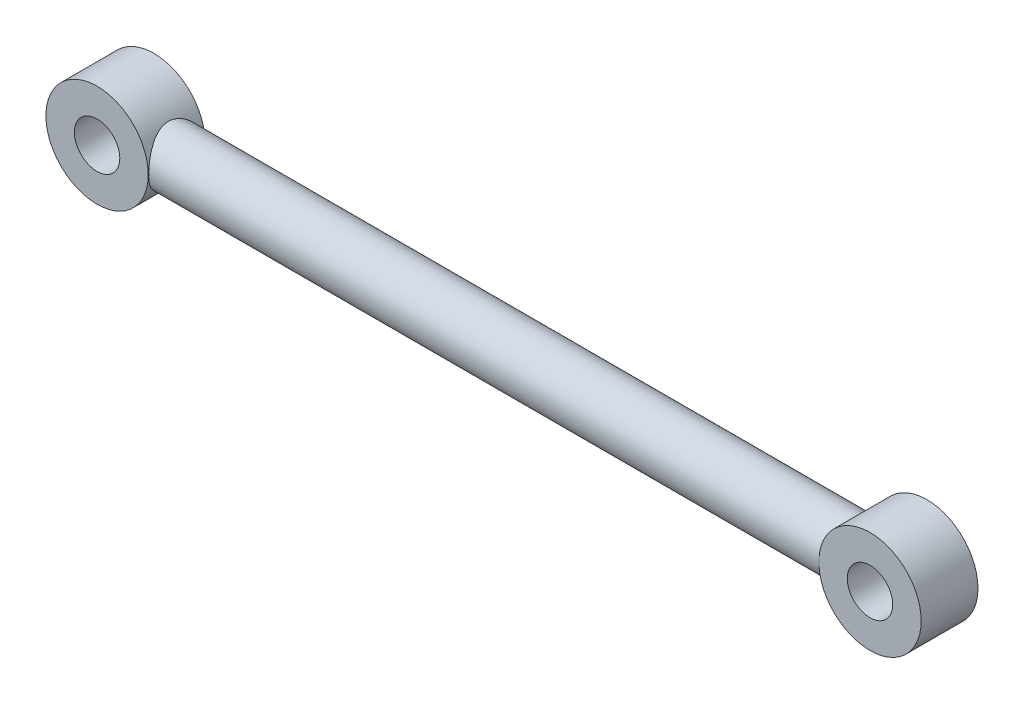
ISO-10303-21;
HEADER;
FILE_DESCRIPTION(('STEP AP214'),'2;1');
FILE_NAME('part.step','',(''),(''),'','','');
FILE_SCHEMA(('AUTOMOTIVE_DESIGN { 1 0 10303 214 1 1 1 1 }'));
ENDSEC;
DATA;
#1=APPLICATION_CONTEXT('core data for automotive mechanical design processes');
#2=APPLICATION_PROTOCOL_DEFINITION('international standard','automotive_design',2000,#1);
#3=PRODUCT_CONTEXT('',#1,'mechanical');
#4=PRODUCT('Part','Part','',(#3));
#5=PRODUCT_RELATED_PRODUCT_CATEGORY('part','',(#4));
#6=PRODUCT_DEFINITION_FORMATION('','',#4);
#7=PRODUCT_DEFINITION_CONTEXT('part definition',#1,'design');
#8=PRODUCT_DEFINITION('design','',#6,#7);
#9=PRODUCT_DEFINITION_SHAPE('','',#8);
#10=(LENGTH_UNIT() NAMED_UNIT(*) SI_UNIT(.MILLI.,.METRE.));
#11=(NAMED_UNIT(*) PLANE_ANGLE_UNIT() SI_UNIT($,.RADIAN.));
#12=(NAMED_UNIT(*) SI_UNIT($,.STERADIAN.) SOLID_ANGLE_UNIT());
#13=UNCERTAINTY_MEASURE_WITH_UNIT(LENGTH_MEASURE(1.E-05),#10,'distance_accuracy_value','');
#14=(GEOMETRIC_REPRESENTATION_CONTEXT(3) GLOBAL_UNCERTAINTY_ASSIGNED_CONTEXT((#13)) GLOBAL_UNIT_ASSIGNED_CONTEXT((#10,
#11,#12)) REPRESENTATION_CONTEXT('',''));
#15=CARTESIAN_POINT('',(0.,0.,0.));
#16=DIRECTION('',(0.,0.,1.));
#17=DIRECTION('',(1.,0.,0.));
#18=AXIS2_PLACEMENT_3D('',#15,#16,#17);
#19=CARTESIAN_POINT('',(31.,0.,0.));
#20=DIRECTION('',(-1.,0.,0.));
#21=DIRECTION('',(0.,0.,1.));
#22=AXIS2_PLACEMENT_3D('',#19,#20,#21);
#23=CYLINDRICAL_SURFACE('',#22,2.45);
#24=CARTESIAN_POINT('',(31.,0.,0.));
#25=DIRECTION('',(1.,0.,0.));
#26=DIRECTION('',(0.,0.,-1.));
#27=AXIS2_PLACEMENT_3D('',#24,#25,#26);
#28=CIRCLE('',#27,2.45);
#29=CARTESIAN_POINT('',(31.,0.,-2.45));
#30=VERTEX_POINT('',#29);
#31=EDGE_CURVE('E11',#30,#30,#28,.T.);
#32=ORIENTED_EDGE('',*,*,#31,.F.);
#33=EDGE_LOOP('',(#32));
#34=FACE_BOUND('',#33,.T.);
#35=CARTESIAN_POINT('',(-31.,0.,0.));
#36=DIRECTION('',(1.,0.,0.));
#37=DIRECTION('',(0.,0.,-1.));
#38=AXIS2_PLACEMENT_3D('',#35,#36,#37);
#39=CIRCLE('',#38,2.45);
#40=CARTESIAN_POINT('',(-31.,0.,-2.45));
#41=VERTEX_POINT('',#40);
#42=EDGE_CURVE('E44',#41,#41,#39,.T.);
#43=ORIENTED_EDGE('',*,*,#42,.T.);
#44=EDGE_LOOP('',(#43));
#45=FACE_BOUND('',#44,.T.);
#46=ADVANCED_FACE('F41',(#34,#45),#23,.T.);
#47=CARTESIAN_POINT('',(31.,0.,0.));
#48=DIRECTION('',(1.,0.,0.));
#49=DIRECTION('',(0.,0.,-1.));
#50=AXIS2_PLACEMENT_3D('',#47,#48,#49);
#51=PLANE('',#50);
#52=ORIENTED_EDGE('',*,*,#31,.T.);
#53=EDGE_LOOP('',(#52));
#54=FACE_BOUND('',#53,.T.);
#55=ADVANCED_FACE('F56',(#54),#51,.T.);
#56=CARTESIAN_POINT('',(-31.,0.,0.));
#57=DIRECTION('',(1.,0.,0.));
#58=DIRECTION('',(0.,0.,-1.));
#59=AXIS2_PLACEMENT_3D('',#56,#57,#58);
#60=PLANE('',#59);
#61=ORIENTED_EDGE('',*,*,#42,.F.);
#62=EDGE_LOOP('',(#61));
#63=FACE_BOUND('',#62,.T.);
#64=ADVANCED_FACE('F54',(#63),#60,.F.);
#65=CLOSED_SHELL('',(#46,#55,#64));
#66=MANIFOLD_SOLID_BREP('B2',#65);
#67=CARTESIAN_POINT('',(-34.,0.,2.5));
#68=DIRECTION('',(0.,0.,-1.));
#69=DIRECTION('',(-1.,0.,0.));
#70=AXIS2_PLACEMENT_3D('',#67,#68,#69);
#71=CYLINDRICAL_SURFACE('',#70,4.5);
#72=CARTESIAN_POINT('',(-34.,0.,2.5));
#73=DIRECTION('',(0.,0.,1.));
#74=DIRECTION('',(1.,0.,0.));
#75=AXIS2_PLACEMENT_3D('',#72,#73,#74);
#76=CIRCLE('',#75,4.5);
#77=CARTESIAN_POINT('',(-29.5,0.,2.5));
#78=VERTEX_POINT('',#77);
#79=EDGE_CURVE('E95',#78,#78,#76,.T.);
#80=ORIENTED_EDGE('',*,*,#79,.F.);
#81=EDGE_LOOP('',(#80));
#82=FACE_BOUND('',#81,.T.);
#83=CARTESIAN_POINT('',(-34.,0.,-2.5));
#84=DIRECTION('',(0.,0.,1.));
#85=DIRECTION('',(1.,0.,0.));
#86=AXIS2_PLACEMENT_3D('',#83,#84,#85);
#87=CIRCLE('',#86,4.5);
#88=CARTESIAN_POINT('',(-29.5,0.,-2.5));
#89=VERTEX_POINT('',#88);
#90=EDGE_CURVE('E101',#89,#89,#87,.T.);
#91=ORIENTED_EDGE('',*,*,#90,.T.);
#92=EDGE_LOOP('',(#91));
#93=FACE_BOUND('',#92,.T.);
#94=ADVANCED_FACE('F88',(#82,#93),#71,.T.);
#95=CARTESIAN_POINT('',(-34.,0.,2.5));
#96=DIRECTION('',(0.,0.,-1.));
#97=DIRECTION('',(-1.,0.,0.));
#98=AXIS2_PLACEMENT_3D('',#95,#96,#97);
#99=CYLINDRICAL_SURFACE('',#98,2.);
#100=CARTESIAN_POINT('',(-34.,0.,2.5));
#101=DIRECTION('',(0.,0.,1.));
#102=DIRECTION('',(1.,0.,0.));
#103=AXIS2_PLACEMENT_3D('',#100,#101,#102);
#104=CIRCLE('',#103,2.);
#105=CARTESIAN_POINT('',(-32.,0.,2.5));
#106=VERTEX_POINT('',#105);
#107=EDGE_CURVE('E40',#106,#106,#104,.T.);
#108=ORIENTED_EDGE('',*,*,#107,.T.);
#109=EDGE_LOOP('',(#108));
#110=FACE_BOUND('',#109,.T.);
#111=CARTESIAN_POINT('',(-34.,0.,-2.5));
#112=DIRECTION('',(0.,0.,1.));
#113=DIRECTION('',(1.,0.,0.));
#114=AXIS2_PLACEMENT_3D('',#111,#112,#113);
#115=CIRCLE('',#114,2.);
#116=CARTESIAN_POINT('',(-32.,0.,-2.5));
#117=VERTEX_POINT('',#116);
#118=EDGE_CURVE('E91',#117,#117,#115,.T.);
#119=ORIENTED_EDGE('',*,*,#118,.F.);
#120=EDGE_LOOP('',(#119));
#121=FACE_BOUND('',#120,.T.);
#122=ADVANCED_FACE('F110',(#110,#121),#99,.F.);
#123=CARTESIAN_POINT('',(0.,0.,2.5));
#124=DIRECTION('',(0.,0.,1.));
#125=DIRECTION('',(1.,0.,0.));
#126=AXIS2_PLACEMENT_3D('',#123,#124,#125);
#127=PLANE('',#126);
#128=ORIENTED_EDGE('',*,*,#79,.T.);
#129=EDGE_LOOP('',(#128));
#130=FACE_BOUND('',#129,.T.);
#131=ORIENTED_EDGE('',*,*,#107,.F.);
#132=EDGE_LOOP('',(#131));
#133=FACE_BOUND('',#132,.T.);
#134=ADVANCED_FACE('F112',(#130,#133),#127,.T.);
#135=CARTESIAN_POINT('',(0.,0.,-2.5));
#136=DIRECTION('',(0.,0.,1.));
#137=DIRECTION('',(1.,0.,0.));
#138=AXIS2_PLACEMENT_3D('',#135,#136,#137);
#139=PLANE('',#138);
#140=ORIENTED_EDGE('',*,*,#90,.F.);
#141=EDGE_LOOP('',(#140));
#142=FACE_BOUND('',#141,.T.);
#143=ORIENTED_EDGE('',*,*,#118,.T.);
#144=EDGE_LOOP('',(#143));
#145=FACE_BOUND('',#144,.T.);
#146=ADVANCED_FACE('F108',(#142,#145),#139,.F.);
#147=CLOSED_SHELL('',(#94,#122,#134,#146));
#148=MANIFOLD_SOLID_BREP('B6',#147);
#149=CARTESIAN_POINT('',(34.,0.,2.5));
#150=DIRECTION('',(0.,0.,-1.));
#151=DIRECTION('',(-1.,0.,0.));
#152=AXIS2_PLACEMENT_3D('',#149,#150,#151);
#153=CYLINDRICAL_SURFACE('',#152,2.);
#154=CARTESIAN_POINT('',(34.,0.,2.5));
#155=DIRECTION('',(0.,0.,1.));
#156=DIRECTION('',(1.,0.,0.));
#157=AXIS2_PLACEMENT_3D('',#154,#155,#156);
#158=CIRCLE('',#157,2.);
#159=CARTESIAN_POINT('',(36.,0.,2.5));
#160=VERTEX_POINT('',#159);
#161=EDGE_CURVE('E156',#160,#160,#158,.T.);
#162=ORIENTED_EDGE('',*,*,#161,.T.);
#163=EDGE_LOOP('',(#162));
#164=FACE_BOUND('',#163,.T.);
#165=CARTESIAN_POINT('',(34.,0.,-2.5));
#166=DIRECTION('',(0.,0.,1.));
#167=DIRECTION('',(1.,0.,0.));
#168=AXIS2_PLACEMENT_3D('',#165,#166,#167);
#169=CIRCLE('',#168,2.);
#170=CARTESIAN_POINT('',(36.,0.,-2.5));
#171=VERTEX_POINT('',#170);
#172=EDGE_CURVE('E162',#171,#171,#169,.T.);
#173=ORIENTED_EDGE('',*,*,#172,.F.);
#174=EDGE_LOOP('',(#173));
#175=FACE_BOUND('',#174,.T.);
#176=ADVANCED_FACE('F149',(#164,#175),#153,.F.);
#177=CARTESIAN_POINT('',(34.,0.,2.5));
#178=DIRECTION('',(0.,0.,-1.));
#179=DIRECTION('',(-1.,0.,0.));
#180=AXIS2_PLACEMENT_3D('',#177,#178,#179);
#181=CYLINDRICAL_SURFACE('',#180,4.5);
#182=CARTESIAN_POINT('',(34.,0.,2.5));
#183=DIRECTION('',(0.,0.,1.));
#184=DIRECTION('',(1.,0.,0.));
#185=AXIS2_PLACEMENT_3D('',#182,#183,#184);
#186=CIRCLE('',#185,4.5);
#187=CARTESIAN_POINT('',(38.5,0.,2.5));
#188=VERTEX_POINT('',#187);
#189=EDGE_CURVE('E87',#188,#188,#186,.T.);
#190=ORIENTED_EDGE('',*,*,#189,.F.);
#191=EDGE_LOOP('',(#190));
#192=FACE_BOUND('',#191,.T.);
#193=CARTESIAN_POINT('',(34.,0.,-2.5));
#194=DIRECTION('',(0.,0.,1.));
#195=DIRECTION('',(1.,0.,0.));
#196=AXIS2_PLACEMENT_3D('',#193,#194,#195);
#197=CIRCLE('',#196,4.5);
#198=CARTESIAN_POINT('',(38.5,0.,-2.5));
#199=VERTEX_POINT('',#198);
#200=EDGE_CURVE('E152',#199,#199,#197,.T.);
#201=ORIENTED_EDGE('',*,*,#200,.T.);
#202=EDGE_LOOP('',(#201));
#203=FACE_BOUND('',#202,.T.);
#204=ADVANCED_FACE('F169',(#192,#203),#181,.T.);
#205=CARTESIAN_POINT('',(0.,0.,2.5));
#206=DIRECTION('',(0.,0.,1.));
#207=DIRECTION('',(1.,0.,0.));
#208=AXIS2_PLACEMENT_3D('',#205,#206,#207);
#209=PLANE('',#208);
#210=ORIENTED_EDGE('',*,*,#161,.F.);
#211=EDGE_LOOP('',(#210));
#212=FACE_BOUND('',#211,.T.);
#213=ORIENTED_EDGE('',*,*,#189,.T.);
#214=EDGE_LOOP('',(#213));
#215=FACE_BOUND('',#214,.T.);
#216=ADVANCED_FACE('F173',(#212,#215),#209,.T.);
#217=CARTESIAN_POINT('',(0.,0.,-2.5));
#218=DIRECTION('',(0.,0.,1.));
#219=DIRECTION('',(1.,0.,0.));
#220=AXIS2_PLACEMENT_3D('',#217,#218,#219);
#221=PLANE('',#220);
#222=ORIENTED_EDGE('',*,*,#172,.T.);
#223=EDGE_LOOP('',(#222));
#224=FACE_BOUND('',#223,.T.);
#225=ORIENTED_EDGE('',*,*,#200,.F.);
#226=EDGE_LOOP('',(#225));
#227=FACE_BOUND('',#226,.T.);
#228=ADVANCED_FACE('F171',(#224,#227),#221,.F.);
#229=CLOSED_SHELL('',(#176,#204,#216,#228));
#230=MANIFOLD_SOLID_BREP('B35',#229);
#231=ADVANCED_BREP_SHAPE_REPRESENTATION('',(#18,#66,#148,#230),#14);
#232=SHAPE_DEFINITION_REPRESENTATION(#9,#231);
ENDSEC;
END-ISO-10303-21;
